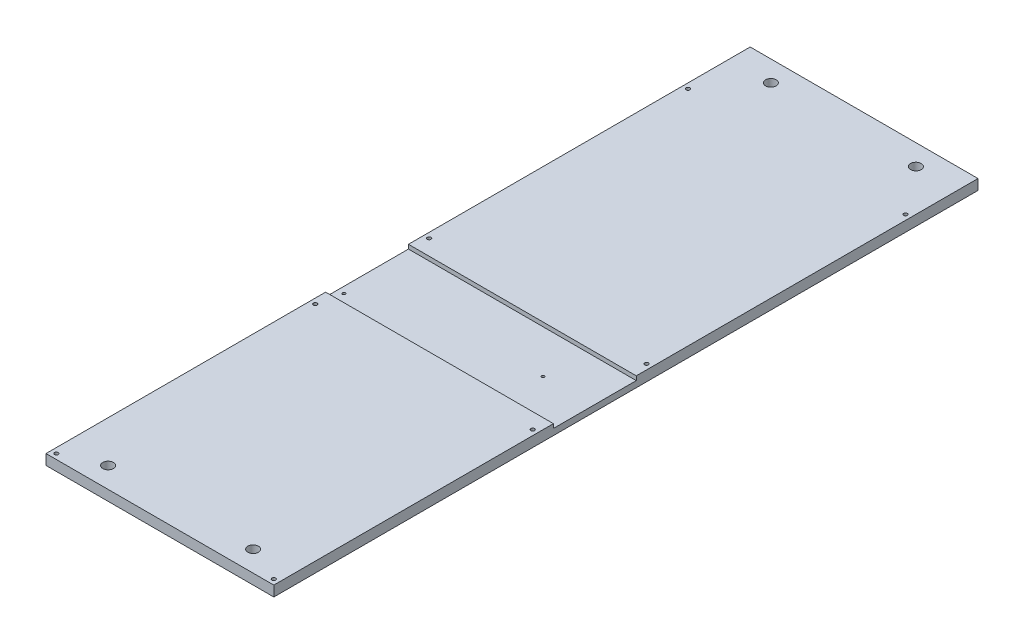
ISO-10303-21;
HEADER;
FILE_DESCRIPTION(('STEP AP214'),'2;1');
FILE_NAME('part.step','',(''),(''),'','','');
FILE_SCHEMA(('AUTOMOTIVE_DESIGN { 1 0 10303 214 1 1 1 1 }'));
ENDSEC;
DATA;
#1=APPLICATION_CONTEXT('core data for automotive mechanical design processes');
#2=APPLICATION_PROTOCOL_DEFINITION('international standard','automotive_design',2000,#1);
#3=PRODUCT_CONTEXT('',#1,'mechanical');
#4=PRODUCT('Part','Part','',(#3));
#5=PRODUCT_RELATED_PRODUCT_CATEGORY('part','',(#4));
#6=PRODUCT_DEFINITION_FORMATION('','',#4);
#7=PRODUCT_DEFINITION_CONTEXT('part definition',#1,'design');
#8=PRODUCT_DEFINITION('design','',#6,#7);
#9=PRODUCT_DEFINITION_SHAPE('','',#8);
#10=(LENGTH_UNIT() NAMED_UNIT(*) SI_UNIT(.MILLI.,.METRE.));
#11=(NAMED_UNIT(*) PLANE_ANGLE_UNIT() SI_UNIT($,.RADIAN.));
#12=(NAMED_UNIT(*) SI_UNIT($,.STERADIAN.) SOLID_ANGLE_UNIT());
#13=UNCERTAINTY_MEASURE_WITH_UNIT(LENGTH_MEASURE(1.E-05),#10,'distance_accuracy_value','');
#14=(GEOMETRIC_REPRESENTATION_CONTEXT(3) GLOBAL_UNCERTAINTY_ASSIGNED_CONTEXT((#13)) GLOBAL_UNIT_ASSIGNED_CONTEXT((#10,
#11,#12)) REPRESENTATION_CONTEXT('',''));
#15=CARTESIAN_POINT('',(0.,0.,0.));
#16=DIRECTION('',(0.,0.,1.));
#17=DIRECTION('',(1.,0.,0.));
#18=AXIS2_PLACEMENT_3D('',#15,#16,#17);
#19=CARTESIAN_POINT('',(0.,6.35,0.));
#20=DIRECTION('',(0.,-1.,0.));
#21=DIRECTION('',(0.,0.,-1.));
#22=AXIS2_PLACEMENT_3D('',#19,#20,#21);
#23=PLANE('',#22);
#24=CARTESIAN_POINT('',(114.3,6.35,-419.1));
#25=DIRECTION('',(0.,1.,0.));
#26=DIRECTION('',(0.,0.,-1.));
#27=AXIS2_PLACEMENT_3D('',#24,#25,#26);
#28=CIRCLE('',#27,3.26390000000001);
#29=CARTESIAN_POINT('',(114.3,6.35,-422.3639));
#30=VERTEX_POINT('',#29);
#31=EDGE_CURVE('E530',#30,#30,#28,.T.);
#32=ORIENTED_EDGE('',*,*,#31,.F.);
#33=EDGE_LOOP('',(#32));
#34=FACE_BOUND('',#33,.T.);
#35=CARTESIAN_POINT('',(25.4,6.35,-419.1));
#36=DIRECTION('',(0.,1.,0.));
#37=DIRECTION('',(0.,0.,1.));
#38=AXIS2_PLACEMENT_3D('',#35,#36,#37);
#39=CIRCLE('',#38,3.26390000000002);
#40=CARTESIAN_POINT('',(25.4,6.35,-415.8361));
#41=VERTEX_POINT('',#40);
#42=EDGE_CURVE('E513',#41,#41,#39,.T.);
#43=ORIENTED_EDGE('',*,*,#42,.F.);
#44=EDGE_LOOP('',(#43));
#45=FACE_BOUND('',#44,.T.);
#46=CARTESIAN_POINT('',(136.525000000001,6.35,-231.775));
#47=DIRECTION('',(0.,1.,0.));
#48=DIRECTION('',(0.,0.,1.));
#49=AXIS2_PLACEMENT_3D('',#46,#47,#48);
#50=CIRCLE('',#49,1.13029999999999);
#51=CARTESIAN_POINT('',(136.525000000001,6.35,-230.6447));
#52=VERTEX_POINT('',#51);
#53=EDGE_CURVE('E161',#52,#52,#50,.T.);
#54=ORIENTED_EDGE('',*,*,#53,.F.);
#55=EDGE_LOOP('',(#54));
#56=FACE_BOUND('',#55,.T.);
#57=CARTESIAN_POINT('',(136.525,6.35,-390.525));
#58=DIRECTION('',(0.,1.,0.));
#59=DIRECTION('',(0.,0.,1.));
#60=AXIS2_PLACEMENT_3D('',#57,#58,#59);
#61=CIRCLE('',#60,1.13029999999999);
#62=CARTESIAN_POINT('',(136.525,6.35,-389.3947));
#63=VERTEX_POINT('',#62);
#64=EDGE_CURVE('E156',#63,#63,#61,.T.);
#65=ORIENTED_EDGE('',*,*,#64,.F.);
#66=EDGE_LOOP('',(#65));
#67=FACE_BOUND('',#66,.T.);
#68=CARTESIAN_POINT('',(3.17499999999992,6.35,-390.525));
#69=DIRECTION('',(0.,-1.,0.));
#70=DIRECTION('',(0.,0.,-1.));
#71=AXIS2_PLACEMENT_3D('',#68,#69,#70);
#72=CIRCLE('',#71,1.1303);
#73=CARTESIAN_POINT('',(3.17499999999992,6.35,-391.6553));
#74=VERTEX_POINT('',#73);
#75=EDGE_CURVE('E150',#74,#74,#72,.T.);
#76=ORIENTED_EDGE('',*,*,#75,.T.);
#77=EDGE_LOOP('',(#76));
#78=FACE_BOUND('',#77,.T.);
#79=CARTESIAN_POINT('',(3.17499999999943,6.35,-231.775));
#80=DIRECTION('',(0.,-1.,0.));
#81=DIRECTION('',(0.,0.,-1.));
#82=AXIS2_PLACEMENT_3D('',#79,#80,#81);
#83=CIRCLE('',#82,1.1303);
#84=CARTESIAN_POINT('',(3.17499999999943,6.35,-232.9053));
#85=VERTEX_POINT('',#84);
#86=EDGE_CURVE('E143',#85,#85,#83,.T.);
#87=ORIENTED_EDGE('',*,*,#86,.T.);
#88=EDGE_LOOP('',(#87));
#89=FACE_BOUND('',#88,.T.);
#90=DIRECTION('',(1.,0.,0.));
#91=VECTOR('',#90,1.);
#92=CARTESIAN_POINT('',(0.,6.35,-222.25));
#93=LINE('',#92,#91);
#94=CARTESIAN_POINT('',(0.,6.35,-222.25));
#95=VERTEX_POINT('',#94);
#96=CARTESIAN_POINT('',(139.7,6.35,-222.25));
#97=VERTEX_POINT('',#96);
#98=EDGE_CURVE('E114',#95,#97,#93,.T.);
#99=ORIENTED_EDGE('',*,*,#98,.T.);
#100=DIRECTION('',(0.,0.,-1.));
#101=VECTOR('',#100,1.);
#102=CARTESIAN_POINT('',(139.7,6.35,0.));
#103=LINE('',#102,#101);
#104=CARTESIAN_POINT('',(139.7,6.35,-431.8));
#105=VERTEX_POINT('',#104);
#106=EDGE_CURVE('E195',#97,#105,#103,.T.);
#107=ORIENTED_EDGE('',*,*,#106,.T.);
#108=DIRECTION('',(-1.,0.,0.));
#109=VECTOR('',#108,1.);
#110=CARTESIAN_POINT('',(0.,6.35,-431.8));
#111=LINE('',#110,#109);
#112=CARTESIAN_POINT('',(0.,6.35,-431.8));
#113=VERTEX_POINT('',#112);
#114=EDGE_CURVE('E57',#105,#113,#111,.T.);
#115=ORIENTED_EDGE('',*,*,#114,.T.);
#116=DIRECTION('',(0.,0.,1.));
#117=VECTOR('',#116,1.);
#118=CARTESIAN_POINT('',(0.,6.35,0.));
#119=LINE('',#118,#117);
#120=EDGE_CURVE('E191',#113,#95,#119,.T.);
#121=ORIENTED_EDGE('',*,*,#120,.T.);
#122=EDGE_LOOP('',(#99,#107,#115,#121));
#123=FACE_BOUND('',#122,.T.);
#124=ADVANCED_FACE('F33',(#34,#45,#56,#67,#78,#89,#123),#23,.F.);
#125=CARTESIAN_POINT('',(0.,6.35,0.));
#126=DIRECTION('',(1.,0.,0.));
#127=DIRECTION('',(0.,0.,-1.));
#128=AXIS2_PLACEMENT_3D('',#125,#126,#127);
#129=PLANE('',#128);
#130=DIRECTION('',(0.,1.,0.));
#131=VECTOR('',#130,1.);
#132=CARTESIAN_POINT('',(0.,3.81,-222.25));
#133=LINE('',#132,#131);
#134=CARTESIAN_POINT('',(0.,3.81,-222.25));
#135=VERTEX_POINT('',#134);
#136=EDGE_CURVE('E109',#135,#95,#133,.T.);
#137=ORIENTED_EDGE('',*,*,#136,.T.);
#138=ORIENTED_EDGE('',*,*,#120,.F.);
#139=DIRECTION('',(0.,-1.,0.));
#140=VECTOR('',#139,1.);
#141=CARTESIAN_POINT('',(0.,6.35,-431.8));
#142=LINE('',#141,#140);
#143=CARTESIAN_POINT('',(0.,0.,-431.8));
#144=VERTEX_POINT('',#143);
#145=EDGE_CURVE('E200',#113,#144,#142,.T.);
#146=ORIENTED_EDGE('',*,*,#145,.T.);
#147=DIRECTION('',(0.,0.,1.));
#148=VECTOR('',#147,1.);
#149=CARTESIAN_POINT('',(0.,0.,0.));
#150=LINE('',#149,#148);
#151=CARTESIAN_POINT('',(0.,0.,0.));
#152=VERTEX_POINT('',#151);
#153=EDGE_CURVE('E188',#144,#152,#150,.T.);
#154=ORIENTED_EDGE('',*,*,#153,.T.);
#155=DIRECTION('',(0.,-1.,0.));
#156=VECTOR('',#155,1.);
#157=CARTESIAN_POINT('',(0.,6.35,0.));
#158=LINE('',#157,#156);
#159=CARTESIAN_POINT('',(0.,6.35,0.));
#160=VERTEX_POINT('',#159);
#161=EDGE_CURVE('E11',#160,#152,#158,.T.);
#162=ORIENTED_EDGE('',*,*,#161,.F.);
#163=CARTESIAN_POINT('',(0.,6.35,-171.45));
#164=VERTEX_POINT('',#163);
#165=EDGE_CURVE('E86',#164,#160,#119,.T.);
#166=ORIENTED_EDGE('',*,*,#165,.F.);
#167=DIRECTION('',(0.,1.,0.));
#168=VECTOR('',#167,1.);
#169=CARTESIAN_POINT('',(0.,3.81,-171.45));
#170=LINE('',#169,#168);
#171=CARTESIAN_POINT('',(0.,3.81,-171.45));
#172=VERTEX_POINT('',#171);
#173=EDGE_CURVE('E118',#172,#164,#170,.T.);
#174=ORIENTED_EDGE('',*,*,#173,.F.);
#175=DIRECTION('',(0.,0.,1.));
#176=VECTOR('',#175,1.);
#177=CARTESIAN_POINT('',(0.,3.81,0.));
#178=LINE('',#177,#176);
#179=EDGE_CURVE('E122',#135,#172,#178,.T.);
#180=ORIENTED_EDGE('',*,*,#179,.F.);
#181=EDGE_LOOP('',(#137,#138,#146,#154,#162,#166,#174,#180));
#182=FACE_BOUND('',#181,.T.);
#183=ADVANCED_FACE('F35',(#182),#129,.F.);
#184=CARTESIAN_POINT('',(139.7,6.35,0.));
#185=DIRECTION('',(-1.,0.,0.));
#186=DIRECTION('',(0.,0.,1.));
#187=AXIS2_PLACEMENT_3D('',#184,#185,#186);
#188=PLANE('',#187);
#189=DIRECTION('',(0.,1.,0.));
#190=VECTOR('',#189,1.);
#191=CARTESIAN_POINT('',(139.7,3.81,-222.25));
#192=LINE('',#191,#190);
#193=CARTESIAN_POINT('',(139.7,3.81,-222.25));
#194=VERTEX_POINT('',#193);
#195=EDGE_CURVE('E136',#194,#97,#192,.T.);
#196=ORIENTED_EDGE('',*,*,#195,.F.);
#197=DIRECTION('',(0.,0.,-1.));
#198=VECTOR('',#197,1.);
#199=CARTESIAN_POINT('',(139.7,3.81,0.));
#200=LINE('',#199,#198);
#201=CARTESIAN_POINT('',(139.7,3.81,-171.45));
#202=VERTEX_POINT('',#201);
#203=EDGE_CURVE('E119',#202,#194,#200,.T.);
#204=ORIENTED_EDGE('',*,*,#203,.F.);
#205=DIRECTION('',(0.,1.,0.));
#206=VECTOR('',#205,1.);
#207=CARTESIAN_POINT('',(139.7,3.81,-171.45));
#208=LINE('',#207,#206);
#209=CARTESIAN_POINT('',(139.7,6.35,-171.45));
#210=VERTEX_POINT('',#209);
#211=EDGE_CURVE('E139',#202,#210,#208,.T.);
#212=ORIENTED_EDGE('',*,*,#211,.T.);
#213=CARTESIAN_POINT('',(139.7,6.35,0.));
#214=VERTEX_POINT('',#213);
#215=EDGE_CURVE('E196',#214,#210,#103,.T.);
#216=ORIENTED_EDGE('',*,*,#215,.F.);
#217=DIRECTION('',(0.,-1.,0.));
#218=VECTOR('',#217,1.);
#219=CARTESIAN_POINT('',(139.7,6.35,0.));
#220=LINE('',#219,#218);
#221=CARTESIAN_POINT('',(139.7,0.,0.));
#222=VERTEX_POINT('',#221);
#223=EDGE_CURVE('E41',#214,#222,#220,.T.);
#224=ORIENTED_EDGE('',*,*,#223,.T.);
#225=DIRECTION('',(0.,0.,-1.));
#226=VECTOR('',#225,1.);
#227=CARTESIAN_POINT('',(139.7,0.,0.));
#228=LINE('',#227,#226);
#229=CARTESIAN_POINT('',(139.7,0.,-431.8));
#230=VERTEX_POINT('',#229);
#231=EDGE_CURVE('E205',#222,#230,#228,.T.);
#232=ORIENTED_EDGE('',*,*,#231,.T.);
#233=DIRECTION('',(0.,-1.,0.));
#234=VECTOR('',#233,1.);
#235=CARTESIAN_POINT('',(139.7,6.35,-431.8));
#236=LINE('',#235,#234);
#237=EDGE_CURVE('E209',#105,#230,#236,.T.);
#238=ORIENTED_EDGE('',*,*,#237,.F.);
#239=ORIENTED_EDGE('',*,*,#106,.F.);
#240=EDGE_LOOP('',(#196,#204,#212,#216,#224,#232,#238,#239));
#241=FACE_BOUND('',#240,.T.);
#242=ADVANCED_FACE('F215',(#241),#188,.F.);
#243=CARTESIAN_POINT('',(25.4,6.35,-12.7));
#244=DIRECTION('',(0.,1.,0.));
#245=DIRECTION('',(0.,0.,-1.));
#246=AXIS2_PLACEMENT_3D('',#243,#244,#245);
#247=CIRCLE('',#246,3.26390000000002);
#248=CARTESIAN_POINT('',(25.4,6.35,-15.9639));
#249=VERTEX_POINT('',#248);
#250=EDGE_CURVE('E248',#249,#249,#247,.T.);
#251=ORIENTED_EDGE('',*,*,#250,.F.);
#252=EDGE_LOOP('',(#251));
#253=FACE_BOUND('',#252,.T.);
#254=CARTESIAN_POINT('',(114.3,6.35,-12.7));
#255=DIRECTION('',(0.,1.,0.));
#256=DIRECTION('',(0.,0.,1.));
#257=AXIS2_PLACEMENT_3D('',#254,#255,#256);
#258=CIRCLE('',#257,3.26390000000001);
#259=CARTESIAN_POINT('',(114.3,6.35,-9.43609999999997));
#260=VERTEX_POINT('',#259);
#261=EDGE_CURVE('E252',#260,#260,#258,.T.);
#262=ORIENTED_EDGE('',*,*,#261,.F.);
#263=EDGE_LOOP('',(#262));
#264=FACE_BOUND('',#263,.T.);
#265=CARTESIAN_POINT('',(3.17499999999945,6.35,-161.925));
#266=DIRECTION('',(0.,1.,0.));
#267=DIRECTION('',(0.,0.,1.));
#268=AXIS2_PLACEMENT_3D('',#265,#266,#267);
#269=CIRCLE('',#268,1.1303);
#270=CARTESIAN_POINT('',(3.17499999999945,6.35,-160.7947));
#271=VERTEX_POINT('',#270);
#272=EDGE_CURVE('E168',#271,#271,#269,.T.);
#273=ORIENTED_EDGE('',*,*,#272,.F.);
#274=EDGE_LOOP('',(#273));
#275=FACE_BOUND('',#274,.T.);
#276=CARTESIAN_POINT('',(3.175,6.35,-3.17499999999998));
#277=DIRECTION('',(0.,1.,0.));
#278=DIRECTION('',(0.,0.,1.));
#279=AXIS2_PLACEMENT_3D('',#276,#277,#278);
#280=CIRCLE('',#279,1.1303);
#281=CARTESIAN_POINT('',(3.175,6.35,-2.04469999999998));
#282=VERTEX_POINT('',#281);
#283=EDGE_CURVE('E176',#282,#282,#280,.T.);
#284=ORIENTED_EDGE('',*,*,#283,.F.);
#285=EDGE_LOOP('',(#284));
#286=FACE_BOUND('',#285,.T.);
#287=ORIENTED_EDGE('',*,*,#215,.T.);
#288=DIRECTION('',(1.,0.,0.));
#289=VECTOR('',#288,1.);
#290=CARTESIAN_POINT('',(0.,6.35,-171.45));
#291=LINE('',#290,#289);
#292=EDGE_CURVE('E126',#164,#210,#291,.T.);
#293=ORIENTED_EDGE('',*,*,#292,.F.);
#294=ORIENTED_EDGE('',*,*,#165,.T.);
#295=DIRECTION('',(1.,0.,0.));
#296=VECTOR('',#295,1.);
#297=CARTESIAN_POINT('',(0.,6.35,0.));
#298=LINE('',#297,#296);
#299=EDGE_CURVE('E193',#160,#214,#298,.T.);
#300=ORIENTED_EDGE('',*,*,#299,.T.);
#301=EDGE_LOOP('',(#287,#293,#294,#300));
#302=FACE_BOUND('',#301,.T.);
#303=CARTESIAN_POINT('',(136.525,6.35,-3.17499999999998));
#304=DIRECTION('',(0.,1.,0.));
#305=DIRECTION('',(0.,0.,1.));
#306=AXIS2_PLACEMENT_3D('',#303,#304,#305);
#307=CIRCLE('',#306,1.13030000000002);
#308=CARTESIAN_POINT('',(136.525,6.35,-2.04469999999997));
#309=VERTEX_POINT('',#308);
#310=EDGE_CURVE('E173',#309,#309,#307,.F.);
#311=ORIENTED_EDGE('',*,*,#310,.T.);
#312=EDGE_LOOP('',(#311));
#313=FACE_BOUND('',#312,.T.);
#314=CARTESIAN_POINT('',(136.525000000001,6.35,-161.925));
#315=DIRECTION('',(0.,-1.,0.));
#316=DIRECTION('',(0.,0.,-1.));
#317=AXIS2_PLACEMENT_3D('',#314,#315,#316);
#318=CIRCLE('',#317,1.13030000000002);
#319=CARTESIAN_POINT('',(136.525000000001,6.35,-163.0553));
#320=VERTEX_POINT('',#319);
#321=EDGE_CURVE('E180',#320,#320,#318,.T.);
#322=ORIENTED_EDGE('',*,*,#321,.T.);
#323=EDGE_LOOP('',(#322));
#324=FACE_BOUND('',#323,.T.);
#325=ADVANCED_FACE('F228',(#253,#264,#275,#286,#302,#313,#324),#23,.F.);
#326=CARTESIAN_POINT('',(0.,0.,0.));
#327=DIRECTION('',(0.,-1.,0.));
#328=DIRECTION('',(0.,0.,-1.));
#329=AXIS2_PLACEMENT_3D('',#326,#327,#328);
#330=PLANE('',#329);
#331=CARTESIAN_POINT('',(25.4,0.,-12.7));
#332=DIRECTION('',(0.,1.,0.));
#333=DIRECTION('',(0.,0.,-1.));
#334=AXIS2_PLACEMENT_3D('',#331,#332,#333);
#335=CIRCLE('',#334,3.26390000000002);
#336=CARTESIAN_POINT('',(25.4,0.,-15.9639));
#337=VERTEX_POINT('',#336);
#338=EDGE_CURVE('E523',#337,#337,#335,.T.);
#339=ORIENTED_EDGE('',*,*,#338,.T.);
#340=EDGE_LOOP('',(#339));
#341=FACE_BOUND('',#340,.T.);
#342=CARTESIAN_POINT('',(114.3,0.,-12.7));
#343=DIRECTION('',(0.,1.,0.));
#344=DIRECTION('',(0.,0.,1.));
#345=AXIS2_PLACEMENT_3D('',#342,#343,#344);
#346=CIRCLE('',#345,3.26390000000001);
#347=CARTESIAN_POINT('',(114.3,0.,-9.43609999999997));
#348=VERTEX_POINT('',#347);
#349=EDGE_CURVE('E527',#348,#348,#346,.T.);
#350=ORIENTED_EDGE('',*,*,#349,.T.);
#351=EDGE_LOOP('',(#350));
#352=FACE_BOUND('',#351,.T.);
#353=CARTESIAN_POINT('',(114.3,0.,-419.1));
#354=DIRECTION('',(0.,1.,0.));
#355=DIRECTION('',(0.,0.,-1.));
#356=AXIS2_PLACEMENT_3D('',#353,#354,#355);
#357=CIRCLE('',#356,3.26390000000001);
#358=CARTESIAN_POINT('',(114.3,0.,-422.3639));
#359=VERTEX_POINT('',#358);
#360=EDGE_CURVE('E520',#359,#359,#357,.T.);
#361=ORIENTED_EDGE('',*,*,#360,.T.);
#362=EDGE_LOOP('',(#361));
#363=FACE_BOUND('',#362,.T.);
#364=CARTESIAN_POINT('',(25.4,0.,-419.1));
#365=DIRECTION('',(0.,1.,0.));
#366=DIRECTION('',(0.,0.,1.));
#367=AXIS2_PLACEMENT_3D('',#364,#365,#366);
#368=CIRCLE('',#367,3.26390000000002);
#369=CARTESIAN_POINT('',(25.4,0.,-415.8361));
#370=VERTEX_POINT('',#369);
#371=EDGE_CURVE('E509',#370,#370,#368,.T.);
#372=ORIENTED_EDGE('',*,*,#371,.T.);
#373=EDGE_LOOP('',(#372));
#374=FACE_BOUND('',#373,.T.);
#375=CARTESIAN_POINT('',(3.81,0.,-178.816));
#376=DIRECTION('',(0.,1.,0.));
#377=DIRECTION('',(0.,0.,1.));
#378=AXIS2_PLACEMENT_3D('',#375,#376,#377);
#379=CIRCLE('',#378,0.889000000000012);
#380=CARTESIAN_POINT('',(3.81,0.,-177.927));
#381=VERTEX_POINT('',#380);
#382=EDGE_CURVE('E134',#381,#381,#379,.T.);
#383=ORIENTED_EDGE('',*,*,#382,.T.);
#384=EDGE_LOOP('',(#383));
#385=FACE_BOUND('',#384,.T.);
#386=CARTESIAN_POINT('',(108.966,0.,-195.834));
#387=DIRECTION('',(0.,1.,0.));
#388=DIRECTION('',(0.,0.,1.));
#389=AXIS2_PLACEMENT_3D('',#386,#387,#388);
#390=CIRCLE('',#389,0.88900000000002);
#391=CARTESIAN_POINT('',(108.966,0.,-194.945));
#392=VERTEX_POINT('',#391);
#393=EDGE_CURVE('E508',#392,#392,#390,.T.);
#394=ORIENTED_EDGE('',*,*,#393,.T.);
#395=EDGE_LOOP('',(#394));
#396=FACE_BOUND('',#395,.T.);
#397=CARTESIAN_POINT('',(3.17499999999945,0.,-161.925));
#398=DIRECTION('',(0.,1.,0.));
#399=DIRECTION('',(0.,0.,1.));
#400=AXIS2_PLACEMENT_3D('',#397,#398,#399);
#401=CIRCLE('',#400,1.1303);
#402=CARTESIAN_POINT('',(3.17499999999945,0.,-160.7947));
#403=VERTEX_POINT('',#402);
#404=EDGE_CURVE('E146',#403,#403,#401,.T.);
#405=ORIENTED_EDGE('',*,*,#404,.T.);
#406=EDGE_LOOP('',(#405));
#407=FACE_BOUND('',#406,.T.);
#408=CARTESIAN_POINT('',(136.525000000001,0.,-231.775));
#409=DIRECTION('',(0.,1.,0.));
#410=DIRECTION('',(0.,0.,1.));
#411=AXIS2_PLACEMENT_3D('',#408,#409,#410);
#412=CIRCLE('',#411,1.13029999999999);
#413=CARTESIAN_POINT('',(136.525000000001,0.,-230.6447));
#414=VERTEX_POINT('',#413);
#415=EDGE_CURVE('E165',#414,#414,#412,.T.);
#416=ORIENTED_EDGE('',*,*,#415,.T.);
#417=EDGE_LOOP('',(#416));
#418=FACE_BOUND('',#417,.T.);
#419=CARTESIAN_POINT('',(136.525,0.,-3.17499999999998));
#420=DIRECTION('',(0.,1.,0.));
#421=DIRECTION('',(0.,0.,1.));
#422=AXIS2_PLACEMENT_3D('',#419,#420,#421);
#423=CIRCLE('',#422,1.13030000000002);
#424=CARTESIAN_POINT('',(136.525,0.,-2.04469999999997));
#425=VERTEX_POINT('',#424);
#426=EDGE_CURVE('E177',#425,#425,#423,.F.);
#427=ORIENTED_EDGE('',*,*,#426,.F.);
#428=EDGE_LOOP('',(#427));
#429=FACE_BOUND('',#428,.T.);
#430=CARTESIAN_POINT('',(3.17499999999992,0.,-390.525));
#431=DIRECTION('',(0.,-1.,0.));
#432=DIRECTION('',(0.,0.,-1.));
#433=AXIS2_PLACEMENT_3D('',#430,#431,#432);
#434=CIRCLE('',#433,1.1303);
#435=CARTESIAN_POINT('',(3.17499999999992,0.,-391.6553));
#436=VERTEX_POINT('',#435);
#437=EDGE_CURVE('E153',#436,#436,#434,.T.);
#438=ORIENTED_EDGE('',*,*,#437,.F.);
#439=EDGE_LOOP('',(#438));
#440=FACE_BOUND('',#439,.T.);
#441=CARTESIAN_POINT('',(136.525,0.,-390.525));
#442=DIRECTION('',(0.,1.,0.));
#443=DIRECTION('',(0.,0.,1.));
#444=AXIS2_PLACEMENT_3D('',#441,#442,#443);
#445=CIRCLE('',#444,1.13029999999999);
#446=CARTESIAN_POINT('',(136.525,0.,-389.3947));
#447=VERTEX_POINT('',#446);
#448=EDGE_CURVE('E138',#447,#447,#445,.T.);
#449=ORIENTED_EDGE('',*,*,#448,.T.);
#450=EDGE_LOOP('',(#449));
#451=FACE_BOUND('',#450,.T.);
#452=CARTESIAN_POINT('',(3.175,0.,-3.17499999999998));
#453=DIRECTION('',(0.,1.,0.));
#454=DIRECTION('',(0.,0.,1.));
#455=AXIS2_PLACEMENT_3D('',#452,#453,#454);
#456=CIRCLE('',#455,1.1303);
#457=CARTESIAN_POINT('',(3.175,0.,-2.04469999999998));
#458=VERTEX_POINT('',#457);
#459=EDGE_CURVE('E185',#458,#458,#456,.T.);
#460=ORIENTED_EDGE('',*,*,#459,.T.);
#461=EDGE_LOOP('',(#460));
#462=FACE_BOUND('',#461,.T.);
#463=ORIENTED_EDGE('',*,*,#153,.F.);
#464=DIRECTION('',(-1.,0.,0.));
#465=VECTOR('',#464,1.);
#466=CARTESIAN_POINT('',(0.,0.,-431.8));
#467=LINE('',#466,#465);
#468=EDGE_CURVE('E78',#230,#144,#467,.T.);
#469=ORIENTED_EDGE('',*,*,#468,.F.);
#470=ORIENTED_EDGE('',*,*,#231,.F.);
#471=DIRECTION('',(1.,0.,0.));
#472=VECTOR('',#471,1.);
#473=CARTESIAN_POINT('',(0.,0.,0.));
#474=LINE('',#473,#472);
#475=EDGE_CURVE('E203',#152,#222,#474,.T.);
#476=ORIENTED_EDGE('',*,*,#475,.F.);
#477=EDGE_LOOP('',(#463,#469,#470,#476));
#478=FACE_BOUND('',#477,.T.);
#479=CARTESIAN_POINT('',(3.17499999999943,0.,-231.775));
#480=DIRECTION('',(0.,-1.,0.));
#481=DIRECTION('',(0.,0.,-1.));
#482=AXIS2_PLACEMENT_3D('',#479,#480,#481);
#483=CIRCLE('',#482,1.1303);
#484=CARTESIAN_POINT('',(3.17499999999943,0.,-232.9053));
#485=VERTEX_POINT('',#484);
#486=EDGE_CURVE('E147',#485,#485,#483,.T.);
#487=ORIENTED_EDGE('',*,*,#486,.F.);
#488=EDGE_LOOP('',(#487));
#489=FACE_BOUND('',#488,.T.);
#490=CARTESIAN_POINT('',(136.525000000001,0.,-161.925));
#491=DIRECTION('',(0.,-1.,0.));
#492=DIRECTION('',(0.,0.,-1.));
#493=AXIS2_PLACEMENT_3D('',#490,#491,#492);
#494=CIRCLE('',#493,1.13030000000002);
#495=CARTESIAN_POINT('',(136.525000000001,0.,-163.0553));
#496=VERTEX_POINT('',#495);
#497=EDGE_CURVE('E164',#496,#496,#494,.T.);
#498=ORIENTED_EDGE('',*,*,#497,.F.);
#499=EDGE_LOOP('',(#498));
#500=FACE_BOUND('',#499,.T.);
#501=ADVANCED_FACE('F220',(#341,#352,#363,#374,#385,#396,#407,#418,#429,#440,#451,#462,#478,
#489,#500),#330,.T.);
#502=CARTESIAN_POINT('',(0.,6.35,0.));
#503=DIRECTION('',(0.,0.,-1.));
#504=DIRECTION('',(-1.,0.,0.));
#505=AXIS2_PLACEMENT_3D('',#502,#503,#504);
#506=PLANE('',#505);
#507=ORIENTED_EDGE('',*,*,#475,.T.);
#508=ORIENTED_EDGE('',*,*,#223,.F.);
#509=ORIENTED_EDGE('',*,*,#299,.F.);
#510=ORIENTED_EDGE('',*,*,#161,.T.);
#511=EDGE_LOOP('',(#507,#508,#509,#510));
#512=FACE_BOUND('',#511,.T.);
#513=ADVANCED_FACE('F242',(#512),#506,.F.);
#514=CARTESIAN_POINT('',(0.,6.35,-431.8));
#515=DIRECTION('',(0.,0.,1.));
#516=DIRECTION('',(1.,0.,0.));
#517=AXIS2_PLACEMENT_3D('',#514,#515,#516);
#518=PLANE('',#517);
#519=ORIENTED_EDGE('',*,*,#468,.T.);
#520=ORIENTED_EDGE('',*,*,#145,.F.);
#521=ORIENTED_EDGE('',*,*,#114,.F.);
#522=ORIENTED_EDGE('',*,*,#237,.T.);
#523=EDGE_LOOP('',(#519,#520,#521,#522));
#524=FACE_BOUND('',#523,.T.);
#525=ADVANCED_FACE('F223',(#524),#518,.F.);
#526=CARTESIAN_POINT('',(3.175,0.,-3.17499999999998));
#527=DIRECTION('',(0.,1.,0.));
#528=DIRECTION('',(0.,0.,1.));
#529=AXIS2_PLACEMENT_3D('',#526,#527,#528);
#530=CYLINDRICAL_SURFACE('',#529,1.1303);
#531=ORIENTED_EDGE('',*,*,#459,.F.);
#532=EDGE_LOOP('',(#531));
#533=FACE_BOUND('',#532,.T.);
#534=ORIENTED_EDGE('',*,*,#283,.T.);
#535=EDGE_LOOP('',(#534));
#536=FACE_BOUND('',#535,.T.);
#537=ADVANCED_FACE('F278',(#533,#536),#530,.F.);
#538=CARTESIAN_POINT('',(136.525,0.,-390.525));
#539=DIRECTION('',(0.,1.,0.));
#540=DIRECTION('',(0.,0.,1.));
#541=AXIS2_PLACEMENT_3D('',#538,#539,#540);
#542=CYLINDRICAL_SURFACE('',#541,1.13029999999999);
#543=ORIENTED_EDGE('',*,*,#448,.F.);
#544=EDGE_LOOP('',(#543));
#545=FACE_BOUND('',#544,.T.);
#546=ORIENTED_EDGE('',*,*,#64,.T.);
#547=EDGE_LOOP('',(#546));
#548=FACE_BOUND('',#547,.T.);
#549=ADVANCED_FACE('F280',(#545,#548),#542,.F.);
#550=CARTESIAN_POINT('',(3.17499999999992,0.,-390.525));
#551=DIRECTION('',(0.,1.,0.));
#552=DIRECTION('',(0.,0.,1.));
#553=AXIS2_PLACEMENT_3D('',#550,#551,#552);
#554=CYLINDRICAL_SURFACE('',#553,1.1303);
#555=ORIENTED_EDGE('',*,*,#437,.T.);
#556=EDGE_LOOP('',(#555));
#557=FACE_BOUND('',#556,.T.);
#558=ORIENTED_EDGE('',*,*,#75,.F.);
#559=EDGE_LOOP('',(#558));
#560=FACE_BOUND('',#559,.T.);
#561=ADVANCED_FACE('F286',(#557,#560),#554,.F.);
#562=CARTESIAN_POINT('',(3.17499999999943,0.,-231.775));
#563=DIRECTION('',(0.,1.,0.));
#564=DIRECTION('',(0.,0.,1.));
#565=AXIS2_PLACEMENT_3D('',#562,#563,#564);
#566=CYLINDRICAL_SURFACE('',#565,1.1303);
#567=ORIENTED_EDGE('',*,*,#486,.T.);
#568=EDGE_LOOP('',(#567));
#569=FACE_BOUND('',#568,.T.);
#570=ORIENTED_EDGE('',*,*,#86,.F.);
#571=EDGE_LOOP('',(#570));
#572=FACE_BOUND('',#571,.T.);
#573=ADVANCED_FACE('F274',(#569,#572),#566,.F.);
#574=CARTESIAN_POINT('',(136.525,0.,-3.17499999999998));
#575=DIRECTION('',(0.,1.,0.));
#576=DIRECTION('',(0.,0.,1.));
#577=AXIS2_PLACEMENT_3D('',#574,#575,#576);
#578=CYLINDRICAL_SURFACE('',#577,1.13030000000002);
#579=ORIENTED_EDGE('',*,*,#426,.T.);
#580=EDGE_LOOP('',(#579));
#581=FACE_BOUND('',#580,.T.);
#582=ORIENTED_EDGE('',*,*,#310,.F.);
#583=EDGE_LOOP('',(#582));
#584=FACE_BOUND('',#583,.T.);
#585=ADVANCED_FACE('F264',(#581,#584),#578,.F.);
#586=CARTESIAN_POINT('',(136.525000000001,0.,-161.925));
#587=DIRECTION('',(0.,1.,0.));
#588=DIRECTION('',(0.,0.,1.));
#589=AXIS2_PLACEMENT_3D('',#586,#587,#588);
#590=CYLINDRICAL_SURFACE('',#589,1.13030000000002);
#591=ORIENTED_EDGE('',*,*,#497,.T.);
#592=EDGE_LOOP('',(#591));
#593=FACE_BOUND('',#592,.T.);
#594=ORIENTED_EDGE('',*,*,#321,.F.);
#595=EDGE_LOOP('',(#594));
#596=FACE_BOUND('',#595,.T.);
#597=ADVANCED_FACE('F261',(#593,#596),#590,.F.);
#598=CARTESIAN_POINT('',(136.525000000001,0.,-231.775));
#599=DIRECTION('',(0.,1.,0.));
#600=DIRECTION('',(0.,0.,1.));
#601=AXIS2_PLACEMENT_3D('',#598,#599,#600);
#602=CYLINDRICAL_SURFACE('',#601,1.13029999999999);
#603=ORIENTED_EDGE('',*,*,#415,.F.);
#604=EDGE_LOOP('',(#603));
#605=FACE_BOUND('',#604,.T.);
#606=ORIENTED_EDGE('',*,*,#53,.T.);
#607=EDGE_LOOP('',(#606));
#608=FACE_BOUND('',#607,.T.);
#609=ADVANCED_FACE('F263',(#605,#608),#602,.F.);
#610=CARTESIAN_POINT('',(3.17499999999945,0.,-161.925));
#611=DIRECTION('',(0.,1.,0.));
#612=DIRECTION('',(0.,0.,1.));
#613=AXIS2_PLACEMENT_3D('',#610,#611,#612);
#614=CYLINDRICAL_SURFACE('',#613,1.1303);
#615=ORIENTED_EDGE('',*,*,#404,.F.);
#616=EDGE_LOOP('',(#615));
#617=FACE_BOUND('',#616,.T.);
#618=ORIENTED_EDGE('',*,*,#272,.T.);
#619=EDGE_LOOP('',(#618));
#620=FACE_BOUND('',#619,.T.);
#621=ADVANCED_FACE('F271',(#617,#620),#614,.F.);
#622=CARTESIAN_POINT('',(0.,3.81,-222.25));
#623=DIRECTION('',(0.,0.,1.));
#624=DIRECTION('',(1.,0.,0.));
#625=AXIS2_PLACEMENT_3D('',#622,#623,#624);
#626=PLANE('',#625);
#627=ORIENTED_EDGE('',*,*,#98,.F.);
#628=ORIENTED_EDGE('',*,*,#136,.F.);
#629=DIRECTION('',(1.,0.,0.));
#630=VECTOR('',#629,1.);
#631=CARTESIAN_POINT('',(0.,3.81,-222.25));
#632=LINE('',#631,#630);
#633=EDGE_CURVE('E112',#135,#194,#632,.T.);
#634=ORIENTED_EDGE('',*,*,#633,.T.);
#635=ORIENTED_EDGE('',*,*,#195,.T.);
#636=EDGE_LOOP('',(#627,#628,#634,#635));
#637=FACE_BOUND('',#636,.T.);
#638=ADVANCED_FACE('F111',(#637),#626,.T.);
#639=CARTESIAN_POINT('',(0.,3.81,-171.45));
#640=DIRECTION('',(0.,0.,1.));
#641=DIRECTION('',(1.,0.,0.));
#642=AXIS2_PLACEMENT_3D('',#639,#640,#641);
#643=PLANE('',#642);
#644=ORIENTED_EDGE('',*,*,#292,.T.);
#645=ORIENTED_EDGE('',*,*,#211,.F.);
#646=DIRECTION('',(1.,0.,0.));
#647=VECTOR('',#646,1.);
#648=CARTESIAN_POINT('',(0.,3.81,-171.45));
#649=LINE('',#648,#647);
#650=EDGE_CURVE('E48',#172,#202,#649,.T.);
#651=ORIENTED_EDGE('',*,*,#650,.F.);
#652=ORIENTED_EDGE('',*,*,#173,.T.);
#653=EDGE_LOOP('',(#644,#645,#651,#652));
#654=FACE_BOUND('',#653,.T.);
#655=ADVANCED_FACE('F363',(#654),#643,.F.);
#656=CARTESIAN_POINT('',(0.,3.81,0.));
#657=DIRECTION('',(0.,1.,0.));
#658=DIRECTION('',(0.,0.,1.));
#659=AXIS2_PLACEMENT_3D('',#656,#657,#658);
#660=PLANE('',#659);
#661=CARTESIAN_POINT('',(3.81,3.81,-178.816));
#662=DIRECTION('',(0.,1.,0.));
#663=DIRECTION('',(0.,0.,1.));
#664=AXIS2_PLACEMENT_3D('',#661,#662,#663);
#665=CIRCLE('',#664,0.889000000000012);
#666=CARTESIAN_POINT('',(3.81,3.81,-177.927));
#667=VERTEX_POINT('',#666);
#668=EDGE_CURVE('E503',#667,#667,#665,.T.);
#669=ORIENTED_EDGE('',*,*,#668,.F.);
#670=EDGE_LOOP('',(#669));
#671=FACE_BOUND('',#670,.T.);
#672=CARTESIAN_POINT('',(108.966,3.81,-195.834));
#673=DIRECTION('',(0.,1.,0.));
#674=DIRECTION('',(0.,0.,1.));
#675=AXIS2_PLACEMENT_3D('',#672,#673,#674);
#676=CIRCLE('',#675,0.88900000000002);
#677=CARTESIAN_POINT('',(108.966,3.81,-194.945));
#678=VERTEX_POINT('',#677);
#679=EDGE_CURVE('E506',#678,#678,#676,.T.);
#680=ORIENTED_EDGE('',*,*,#679,.F.);
#681=EDGE_LOOP('',(#680));
#682=FACE_BOUND('',#681,.T.);
#683=ORIENTED_EDGE('',*,*,#633,.F.);
#684=ORIENTED_EDGE('',*,*,#179,.T.);
#685=ORIENTED_EDGE('',*,*,#650,.T.);
#686=ORIENTED_EDGE('',*,*,#203,.T.);
#687=EDGE_LOOP('',(#683,#684,#685,#686));
#688=FACE_BOUND('',#687,.T.);
#689=ADVANCED_FACE('F121',(#671,#682,#688),#660,.T.);
#690=CARTESIAN_POINT('',(108.966,0.,-195.834));
#691=DIRECTION('',(0.,1.,0.));
#692=DIRECTION('',(0.,0.,1.));
#693=AXIS2_PLACEMENT_3D('',#690,#691,#692);
#694=CYLINDRICAL_SURFACE('',#693,0.88900000000002);
#695=CARTESIAN_POINT('',(108.966,0.,-194.945));
#696=CARTESIAN_POINT('',(108.966,0.0396874999999999,-194.945));
#697=CARTESIAN_POINT('',(108.966,0.079375,-194.945));
#698=CARTESIAN_POINT('',(108.966,0.15875,-194.945));
#699=CARTESIAN_POINT('',(108.966,0.1984375,-194.945));
#700=CARTESIAN_POINT('',(108.966,0.2778125,-194.945));
#701=CARTESIAN_POINT('',(108.966,0.3175,-194.945));
#702=CARTESIAN_POINT('',(108.966,0.396875,-194.945));
#703=CARTESIAN_POINT('',(108.966,0.4365625,-194.945));
#704=CARTESIAN_POINT('',(108.966,0.5159375,-194.945));
#705=CARTESIAN_POINT('',(108.966,0.555625,-194.945));
#706=CARTESIAN_POINT('',(108.966,0.635,-194.945));
#707=CARTESIAN_POINT('',(108.966,0.6746875,-194.945));
#708=CARTESIAN_POINT('',(108.966,0.7540625,-194.945));
#709=CARTESIAN_POINT('',(108.966,0.79375,-194.945));
#710=CARTESIAN_POINT('',(108.966,0.873125,-194.945));
#711=CARTESIAN_POINT('',(108.966,0.9128125,-194.945));
#712=CARTESIAN_POINT('',(108.966,0.9921875,-194.945));
#713=CARTESIAN_POINT('',(108.966,1.031875,-194.945));
#714=CARTESIAN_POINT('',(108.966,1.11125,-194.945));
#715=CARTESIAN_POINT('',(108.966,1.1509375,-194.945));
#716=CARTESIAN_POINT('',(108.966,1.2303125,-194.945));
#717=CARTESIAN_POINT('',(108.966,1.27,-194.945));
#718=CARTESIAN_POINT('',(108.966,1.349375,-194.945));
#719=CARTESIAN_POINT('',(108.966,1.3890625,-194.945));
#720=CARTESIAN_POINT('',(108.966,1.4684375,-194.945));
#721=CARTESIAN_POINT('',(108.966,1.508125,-194.945));
#722=CARTESIAN_POINT('',(108.966,1.5875,-194.945));
#723=CARTESIAN_POINT('',(108.966,1.6271875,-194.945));
#724=CARTESIAN_POINT('',(108.966,1.7065625,-194.945));
#725=CARTESIAN_POINT('',(108.966,1.74625,-194.945));
#726=CARTESIAN_POINT('',(108.966,1.825625,-194.945));
#727=CARTESIAN_POINT('',(108.966,1.8653125,-194.945));
#728=CARTESIAN_POINT('',(108.966,1.9446875,-194.945));
#729=CARTESIAN_POINT('',(108.966,1.984375,-194.945));
#730=CARTESIAN_POINT('',(108.966,2.06375,-194.945));
#731=CARTESIAN_POINT('',(108.966,2.1034375,-194.945));
#732=CARTESIAN_POINT('',(108.966,2.1828125,-194.945));
#733=CARTESIAN_POINT('',(108.966,2.2225,-194.945));
#734=CARTESIAN_POINT('',(108.966,2.301875,-194.945));
#735=CARTESIAN_POINT('',(108.966,2.3415625,-194.945));
#736=CARTESIAN_POINT('',(108.966,2.4209375,-194.945));
#737=CARTESIAN_POINT('',(108.966,2.460625,-194.945));
#738=CARTESIAN_POINT('',(108.966,2.54,-194.945));
#739=CARTESIAN_POINT('',(108.966,2.5796875,-194.945));
#740=CARTESIAN_POINT('',(108.966,2.6590625,-194.945));
#741=CARTESIAN_POINT('',(108.966,2.69875,-194.945));
#742=CARTESIAN_POINT('',(108.966,2.778125,-194.945));
#743=CARTESIAN_POINT('',(108.966,2.8178125,-194.945));
#744=CARTESIAN_POINT('',(108.966,2.8971875,-194.945));
#745=CARTESIAN_POINT('',(108.966,2.936875,-194.945));
#746=CARTESIAN_POINT('',(108.966,3.01625,-194.945));
#747=CARTESIAN_POINT('',(108.966,3.0559375,-194.945));
#748=CARTESIAN_POINT('',(108.966,3.1353125,-194.945));
#749=CARTESIAN_POINT('',(108.966,3.175,-194.945));
#750=CARTESIAN_POINT('',(108.966,3.254375,-194.945));
#751=CARTESIAN_POINT('',(108.966,3.2940625,-194.945));
#752=CARTESIAN_POINT('',(108.966,3.3734375,-194.945));
#753=CARTESIAN_POINT('',(108.966,3.413125,-194.945));
#754=CARTESIAN_POINT('',(108.966,3.4925,-194.945));
#755=CARTESIAN_POINT('',(108.966,3.5321875,-194.945));
#756=CARTESIAN_POINT('',(108.966,3.6115625,-194.945));
#757=CARTESIAN_POINT('',(108.966,3.65125,-194.945));
#758=CARTESIAN_POINT('',(108.966,3.730625,-194.945));
#759=CARTESIAN_POINT('',(108.966,3.7703125,-194.945));
#760=CARTESIAN_POINT('',(108.966,3.81,-194.945));
#761=B_SPLINE_CURVE_WITH_KNOTS('',3,(#695,#696,#697,#698,#699,#700,#701,#702,#703,#704,#705,
#706,#707,#708,#709,#710,#711,#712,#713,#714,#715,#716,#717,#718,#719,#720,#721,#722,#723,#724,
#725,#726,#727,#728,#729,#730,#731,#732,#733,#734,#735,#736,#737,#738,#739,#740,#741,#742,#743,
#744,#745,#746,#747,#748,#749,#750,#751,#752,#753,#754,#755,#756,#757,#758,#759,#760),
.UNSPECIFIED.,.F.,.F.,(4,2,2,2,2,2,2,2,2,2,2,2,2,2,2,2,2,2,2,2,2,2,2,2,2,2,2,2,2,2,2,2,4),(0.,
0.1190625,0.238125,0.3571875,0.47625,0.5953125,0.714375,0.8334375,0.9525,1.0715625,1.190625,
1.3096875,1.42875,1.5478125,1.666875,1.7859375,1.905,2.0240625,2.143125,2.2621875,2.38125,
2.5003125,2.619375,2.7384375,2.8575,2.9765625,3.095625,3.2146875,3.33375,3.4528125,3.571875,
3.6909375,3.81),.UNSPECIFIED.);
#762=EDGE_CURVE('BSEAM356',#392,#678,#761,.T.);
#763=ORIENTED_EDGE('',*,*,#393,.F.);
#764=ORIENTED_EDGE('',*,*,#679,.T.);
#765=ORIENTED_EDGE('',*,*,#762,.T.);
#766=ORIENTED_EDGE('',*,*,#762,.F.);
#767=EDGE_LOOP('',(#763,#765,#764,#766));
#768=FACE_BOUND('',#767,.T.);
#769=ADVANCED_FACE('F356',(#768),#694,.F.);
#770=CARTESIAN_POINT('',(3.81,0.,-178.816));
#771=DIRECTION('',(0.,1.,0.));
#772=DIRECTION('',(0.,0.,1.));
#773=AXIS2_PLACEMENT_3D('',#770,#771,#772);
#774=CYLINDRICAL_SURFACE('',#773,0.889000000000012);
#775=CARTESIAN_POINT('',(3.81,0.,-177.927));
#776=CARTESIAN_POINT('',(3.81,0.0396874999999999,-177.927));
#777=CARTESIAN_POINT('',(3.81,0.079375,-177.927));
#778=CARTESIAN_POINT('',(3.81,0.15875,-177.927));
#779=CARTESIAN_POINT('',(3.81,0.1984375,-177.927));
#780=CARTESIAN_POINT('',(3.81,0.2778125,-177.927));
#781=CARTESIAN_POINT('',(3.81,0.3175,-177.927));
#782=CARTESIAN_POINT('',(3.81,0.396875,-177.927));
#783=CARTESIAN_POINT('',(3.81,0.4365625,-177.927));
#784=CARTESIAN_POINT('',(3.81,0.5159375,-177.927));
#785=CARTESIAN_POINT('',(3.81,0.555625,-177.927));
#786=CARTESIAN_POINT('',(3.81,0.635,-177.927));
#787=CARTESIAN_POINT('',(3.81,0.6746875,-177.927));
#788=CARTESIAN_POINT('',(3.81,0.7540625,-177.927));
#789=CARTESIAN_POINT('',(3.81,0.79375,-177.927));
#790=CARTESIAN_POINT('',(3.81,0.873125,-177.927));
#791=CARTESIAN_POINT('',(3.81,0.9128125,-177.927));
#792=CARTESIAN_POINT('',(3.81,0.9921875,-177.927));
#793=CARTESIAN_POINT('',(3.81,1.031875,-177.927));
#794=CARTESIAN_POINT('',(3.81,1.11125,-177.927));
#795=CARTESIAN_POINT('',(3.81,1.1509375,-177.927));
#796=CARTESIAN_POINT('',(3.81,1.2303125,-177.927));
#797=CARTESIAN_POINT('',(3.81,1.27,-177.927));
#798=CARTESIAN_POINT('',(3.81,1.349375,-177.927));
#799=CARTESIAN_POINT('',(3.81,1.3890625,-177.927));
#800=CARTESIAN_POINT('',(3.81,1.4684375,-177.927));
#801=CARTESIAN_POINT('',(3.81,1.508125,-177.927));
#802=CARTESIAN_POINT('',(3.81,1.5875,-177.927));
#803=CARTESIAN_POINT('',(3.81,1.6271875,-177.927));
#804=CARTESIAN_POINT('',(3.81,1.7065625,-177.927));
#805=CARTESIAN_POINT('',(3.81,1.74625,-177.927));
#806=CARTESIAN_POINT('',(3.81,1.825625,-177.927));
#807=CARTESIAN_POINT('',(3.81,1.8653125,-177.927));
#808=CARTESIAN_POINT('',(3.81,1.9446875,-177.927));
#809=CARTESIAN_POINT('',(3.81,1.984375,-177.927));
#810=CARTESIAN_POINT('',(3.81,2.06375,-177.927));
#811=CARTESIAN_POINT('',(3.81,2.1034375,-177.927));
#812=CARTESIAN_POINT('',(3.81,2.1828125,-177.927));
#813=CARTESIAN_POINT('',(3.81,2.2225,-177.927));
#814=CARTESIAN_POINT('',(3.81,2.301875,-177.927));
#815=CARTESIAN_POINT('',(3.81,2.3415625,-177.927));
#816=CARTESIAN_POINT('',(3.81,2.4209375,-177.927));
#817=CARTESIAN_POINT('',(3.81,2.460625,-177.927));
#818=CARTESIAN_POINT('',(3.81,2.54,-177.927));
#819=CARTESIAN_POINT('',(3.81,2.5796875,-177.927));
#820=CARTESIAN_POINT('',(3.81,2.6590625,-177.927));
#821=CARTESIAN_POINT('',(3.81,2.69875,-177.927));
#822=CARTESIAN_POINT('',(3.81,2.778125,-177.927));
#823=CARTESIAN_POINT('',(3.81,2.8178125,-177.927));
#824=CARTESIAN_POINT('',(3.81,2.8971875,-177.927));
#825=CARTESIAN_POINT('',(3.81,2.936875,-177.927));
#826=CARTESIAN_POINT('',(3.81,3.01625,-177.927));
#827=CARTESIAN_POINT('',(3.81,3.0559375,-177.927));
#828=CARTESIAN_POINT('',(3.81,3.1353125,-177.927));
#829=CARTESIAN_POINT('',(3.81,3.175,-177.927));
#830=CARTESIAN_POINT('',(3.81,3.254375,-177.927));
#831=CARTESIAN_POINT('',(3.81,3.2940625,-177.927));
#832=CARTESIAN_POINT('',(3.81,3.3734375,-177.927));
#833=CARTESIAN_POINT('',(3.81,3.413125,-177.927));
#834=CARTESIAN_POINT('',(3.81,3.4925,-177.927));
#835=CARTESIAN_POINT('',(3.81,3.5321875,-177.927));
#836=CARTESIAN_POINT('',(3.81,3.6115625,-177.927));
#837=CARTESIAN_POINT('',(3.81,3.65125,-177.927));
#838=CARTESIAN_POINT('',(3.81,3.730625,-177.927));
#839=CARTESIAN_POINT('',(3.81,3.7703125,-177.927));
#840=CARTESIAN_POINT('',(3.81,3.81,-177.927));
#841=B_SPLINE_CURVE_WITH_KNOTS('',3,(#775,#776,#777,#778,#779,#780,#781,#782,#783,#784,#785,
#786,#787,#788,#789,#790,#791,#792,#793,#794,#795,#796,#797,#798,#799,#800,#801,#802,#803,#804,
#805,#806,#807,#808,#809,#810,#811,#812,#813,#814,#815,#816,#817,#818,#819,#820,#821,#822,#823,
#824,#825,#826,#827,#828,#829,#830,#831,#832,#833,#834,#835,#836,#837,#838,#839,#840),
.UNSPECIFIED.,.F.,.F.,(4,2,2,2,2,2,2,2,2,2,2,2,2,2,2,2,2,2,2,2,2,2,2,2,2,2,2,2,2,2,2,2,4),(0.,
0.1190625,0.238125,0.3571875,0.47625,0.5953125,0.714375,0.8334375,0.9525,1.0715625,1.190625,
1.3096875,1.42875,1.5478125,1.666875,1.7859375,1.905,2.0240625,2.143125,2.2621875,2.38125,
2.5003125,2.619375,2.7384375,2.8575,2.9765625,3.095625,3.2146875,3.33375,3.4528125,3.571875,
3.6909375,3.81),.UNSPECIFIED.);
#842=EDGE_CURVE('BSEAM316',#381,#667,#841,.T.);
#843=ORIENTED_EDGE('',*,*,#382,.F.);
#844=ORIENTED_EDGE('',*,*,#668,.T.);
#845=ORIENTED_EDGE('',*,*,#842,.T.);
#846=ORIENTED_EDGE('',*,*,#842,.F.);
#847=EDGE_LOOP('',(#843,#845,#844,#846));
#848=FACE_BOUND('',#847,.T.);
#849=ADVANCED_FACE('F316',(#848),#774,.F.);
#850=CARTESIAN_POINT('',(25.4,0.,-419.1));
#851=DIRECTION('',(0.,1.,0.));
#852=DIRECTION('',(0.,0.,1.));
#853=AXIS2_PLACEMENT_3D('',#850,#851,#852);
#854=CYLINDRICAL_SURFACE('',#853,3.26390000000002);
#855=ORIENTED_EDGE('',*,*,#371,.F.);
#856=EDGE_LOOP('',(#855));
#857=FACE_BOUND('',#856,.T.);
#858=ORIENTED_EDGE('',*,*,#42,.T.);
#859=EDGE_LOOP('',(#858));
#860=FACE_BOUND('',#859,.T.);
#861=ADVANCED_FACE('F310',(#857,#860),#854,.F.);
#862=CARTESIAN_POINT('',(114.3,0.,-419.1));
#863=DIRECTION('',(0.,1.,0.));
#864=DIRECTION('',(0.,0.,1.));
#865=AXIS2_PLACEMENT_3D('',#862,#863,#864);
#866=CYLINDRICAL_SURFACE('',#865,3.26390000000001);
#867=ORIENTED_EDGE('',*,*,#360,.F.);
#868=EDGE_LOOP('',(#867));
#869=FACE_BOUND('',#868,.T.);
#870=ORIENTED_EDGE('',*,*,#31,.T.);
#871=EDGE_LOOP('',(#870));
#872=FACE_BOUND('',#871,.T.);
#873=ADVANCED_FACE('F315',(#869,#872),#866,.F.);
#874=CARTESIAN_POINT('',(114.3,0.,-12.7));
#875=DIRECTION('',(0.,1.,0.));
#876=DIRECTION('',(0.,0.,1.));
#877=AXIS2_PLACEMENT_3D('',#874,#875,#876);
#878=CYLINDRICAL_SURFACE('',#877,3.26390000000001);
#879=ORIENTED_EDGE('',*,*,#349,.F.);
#880=EDGE_LOOP('',(#879));
#881=FACE_BOUND('',#880,.T.);
#882=ORIENTED_EDGE('',*,*,#261,.T.);
#883=EDGE_LOOP('',(#882));
#884=FACE_BOUND('',#883,.T.);
#885=ADVANCED_FACE('F328',(#881,#884),#878,.F.);
#886=CARTESIAN_POINT('',(25.4,0.,-12.7));
#887=DIRECTION('',(0.,1.,0.));
#888=DIRECTION('',(0.,0.,1.));
#889=AXIS2_PLACEMENT_3D('',#886,#887,#888);
#890=CYLINDRICAL_SURFACE('',#889,3.26390000000002);
#891=ORIENTED_EDGE('',*,*,#338,.F.);
#892=EDGE_LOOP('',(#891));
#893=FACE_BOUND('',#892,.T.);
#894=ORIENTED_EDGE('',*,*,#250,.T.);
#895=EDGE_LOOP('',(#894));
#896=FACE_BOUND('',#895,.T.);
#897=ADVANCED_FACE('F338',(#893,#896),#890,.F.);
#898=CLOSED_SHELL('',(#124,#183,#242,#325,#501,#513,#525,#537,#549,#561,#573,#585,#597,#609,
#621,#638,#655,#689,#769,#849,#861,#873,#885,#897));
#899=MANIFOLD_SOLID_BREP('B2',#898);
#900=ADVANCED_BREP_SHAPE_REPRESENTATION('',(#18,#899),#14);
#901=SHAPE_DEFINITION_REPRESENTATION(#9,#900);
ENDSEC;
END-ISO-10303-21;
